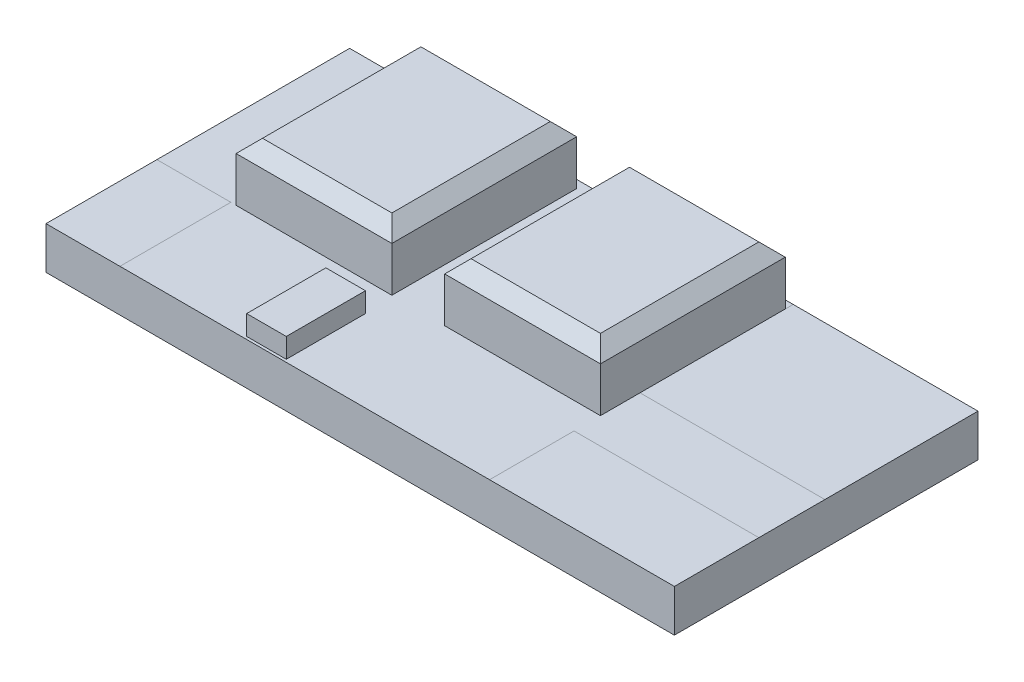
ISO-10303-21;
HEADER;
FILE_DESCRIPTION(('STEP AP214'),'2;1');
FILE_NAME('part.step','',(''),(''),'','','');
FILE_SCHEMA(('AUTOMOTIVE_DESIGN { 1 0 10303 214 1 1 1 1 }'));
ENDSEC;
DATA;
#1=APPLICATION_CONTEXT('core data for automotive mechanical design processes');
#2=APPLICATION_PROTOCOL_DEFINITION('international standard','automotive_design',2000,#1);
#3=PRODUCT_CONTEXT('',#1,'mechanical');
#4=PRODUCT('Part','Part','',(#3));
#5=PRODUCT_RELATED_PRODUCT_CATEGORY('part','',(#4));
#6=PRODUCT_DEFINITION_FORMATION('','',#4);
#7=PRODUCT_DEFINITION_CONTEXT('part definition',#1,'design');
#8=PRODUCT_DEFINITION('design','',#6,#7);
#9=PRODUCT_DEFINITION_SHAPE('','',#8);
#10=(LENGTH_UNIT() NAMED_UNIT(*) SI_UNIT(.MILLI.,.METRE.));
#11=(NAMED_UNIT(*) PLANE_ANGLE_UNIT() SI_UNIT($,.RADIAN.));
#12=(NAMED_UNIT(*) SI_UNIT($,.STERADIAN.) SOLID_ANGLE_UNIT());
#13=UNCERTAINTY_MEASURE_WITH_UNIT(LENGTH_MEASURE(1.E-05),#10,'distance_accuracy_value','');
#14=(GEOMETRIC_REPRESENTATION_CONTEXT(3) GLOBAL_UNCERTAINTY_ASSIGNED_CONTEXT((#13)) GLOBAL_UNIT_ASSIGNED_CONTEXT((#10,
#11,#12)) REPRESENTATION_CONTEXT('',''));
#15=CARTESIAN_POINT('',(0.,0.,0.));
#16=DIRECTION('',(0.,0.,1.));
#17=DIRECTION('',(1.,0.,0.));
#18=AXIS2_PLACEMENT_3D('',#15,#16,#17);
#19=CARTESIAN_POINT('',(-4.40000000000001,2.35,2.65));
#20=DIRECTION('',(1.,0.,0.));
#21=DIRECTION('',(0.,0.,-1.));
#22=AXIS2_PLACEMENT_3D('',#19,#20,#21);
#23=PLANE('',#22);
#24=DIRECTION('',(0.,0.,1.));
#25=VECTOR('',#24,1.);
#26=CARTESIAN_POINT('',(-4.40000000000001,1.6,2.65));
#27=LINE('',#26,#25);
#28=CARTESIAN_POINT('',(-4.40000000000001,1.6,2.65));
#29=VERTEX_POINT('',#28);
#30=CARTESIAN_POINT('',(-4.40000000000001,1.6,5.65));
#31=VERTEX_POINT('',#30);
#32=EDGE_CURVE('E125',#29,#31,#27,.T.);
#33=ORIENTED_EDGE('',*,*,#32,.T.);
#34=DIRECTION('',(0.,-1.,0.));
#35=VECTOR('',#34,1.);
#36=CARTESIAN_POINT('',(-4.40000000000001,2.35,5.65));
#37=LINE('',#36,#35);
#38=CARTESIAN_POINT('',(-4.40000000000001,2.35,5.65));
#39=VERTEX_POINT('',#38);
#40=EDGE_CURVE('E12',#39,#31,#37,.T.);
#41=ORIENTED_EDGE('',*,*,#40,.F.);
#42=DIRECTION('',(0.,0.,1.));
#43=VECTOR('',#42,1.);
#44=CARTESIAN_POINT('',(-4.40000000000001,2.35,2.65));
#45=LINE('',#44,#43);
#46=CARTESIAN_POINT('',(-4.40000000000001,2.35,2.65));
#47=VERTEX_POINT('',#46);
#48=EDGE_CURVE('E113',#47,#39,#45,.T.);
#49=ORIENTED_EDGE('',*,*,#48,.F.);
#50=DIRECTION('',(0.,-1.,0.));
#51=VECTOR('',#50,1.);
#52=CARTESIAN_POINT('',(-4.40000000000001,2.35,2.65));
#53=LINE('',#52,#51);
#54=EDGE_CURVE('E121',#47,#29,#53,.T.);
#55=ORIENTED_EDGE('',*,*,#54,.T.);
#56=EDGE_LOOP('',(#33,#41,#49,#55));
#57=FACE_BOUND('',#56,.T.);
#58=ADVANCED_FACE('F62',(#57),#23,.F.);
#59=CARTESIAN_POINT('',(-4.40000000000001,2.35,5.65));
#60=DIRECTION('',(0.,0.,-1.));
#61=DIRECTION('',(-1.,0.,0.));
#62=AXIS2_PLACEMENT_3D('',#59,#60,#61);
#63=PLANE('',#62);
#64=DIRECTION('',(1.,0.,0.));
#65=VECTOR('',#64,1.);
#66=CARTESIAN_POINT('',(-4.40000000000001,1.6,5.65));
#67=LINE('',#66,#65);
#68=CARTESIAN_POINT('',(-2.90000000000001,1.6,5.65));
#69=VERTEX_POINT('',#68);
#70=EDGE_CURVE('E117',#31,#69,#67,.T.);
#71=ORIENTED_EDGE('',*,*,#70,.T.);
#72=DIRECTION('',(0.,-1.,0.));
#73=VECTOR('',#72,1.);
#74=CARTESIAN_POINT('',(-2.90000000000001,2.35,5.65));
#75=LINE('',#74,#73);
#76=CARTESIAN_POINT('',(-2.90000000000001,2.35,5.65));
#77=VERTEX_POINT('',#76);
#78=EDGE_CURVE('E70',#77,#69,#75,.T.);
#79=ORIENTED_EDGE('',*,*,#78,.F.);
#80=DIRECTION('',(1.,0.,0.));
#81=VECTOR('',#80,1.);
#82=CARTESIAN_POINT('',(-4.40000000000001,2.35,5.65));
#83=LINE('',#82,#81);
#84=EDGE_CURVE('E108',#39,#77,#83,.T.);
#85=ORIENTED_EDGE('',*,*,#84,.F.);
#86=ORIENTED_EDGE('',*,*,#40,.T.);
#87=EDGE_LOOP('',(#71,#79,#85,#86));
#88=FACE_BOUND('',#87,.T.);
#89=ADVANCED_FACE('F116',(#88),#63,.F.);
#90=CARTESIAN_POINT('',(-2.90000000000001,2.35,2.65));
#91=DIRECTION('',(-1.,0.,0.));
#92=DIRECTION('',(0.,0.,1.));
#93=AXIS2_PLACEMENT_3D('',#90,#91,#92);
#94=PLANE('',#93);
#95=DIRECTION('',(0.,0.,-1.));
#96=VECTOR('',#95,1.);
#97=CARTESIAN_POINT('',(-2.90000000000001,1.6,2.65));
#98=LINE('',#97,#96);
#99=CARTESIAN_POINT('',(-2.90000000000001,1.6,2.65));
#100=VERTEX_POINT('',#99);
#101=EDGE_CURVE('E95',#69,#100,#98,.T.);
#102=ORIENTED_EDGE('',*,*,#101,.T.);
#103=DIRECTION('',(0.,-1.,0.));
#104=VECTOR('',#103,1.);
#105=CARTESIAN_POINT('',(-2.90000000000001,2.35,2.65));
#106=LINE('',#105,#104);
#107=CARTESIAN_POINT('',(-2.90000000000001,2.35,2.65));
#108=VERTEX_POINT('',#107);
#109=EDGE_CURVE('E118',#108,#100,#106,.T.);
#110=ORIENTED_EDGE('',*,*,#109,.F.);
#111=DIRECTION('',(0.,0.,-1.));
#112=VECTOR('',#111,1.);
#113=CARTESIAN_POINT('',(-2.90000000000001,2.35,2.65));
#114=LINE('',#113,#112);
#115=EDGE_CURVE('E111',#77,#108,#114,.T.);
#116=ORIENTED_EDGE('',*,*,#115,.F.);
#117=ORIENTED_EDGE('',*,*,#78,.T.);
#118=EDGE_LOOP('',(#102,#110,#116,#117));
#119=FACE_BOUND('',#118,.T.);
#120=ADVANCED_FACE('F119',(#119),#94,.F.);
#121=CARTESIAN_POINT('',(-4.40000000000001,2.35,2.65));
#122=DIRECTION('',(0.,0.,1.));
#123=DIRECTION('',(1.,0.,0.));
#124=AXIS2_PLACEMENT_3D('',#121,#122,#123);
#125=PLANE('',#124);
#126=DIRECTION('',(-1.,0.,0.));
#127=VECTOR('',#126,1.);
#128=CARTESIAN_POINT('',(-4.40000000000001,1.6,2.65));
#129=LINE('',#128,#127);
#130=EDGE_CURVE('E101',#100,#29,#129,.T.);
#131=ORIENTED_EDGE('',*,*,#130,.T.);
#132=ORIENTED_EDGE('',*,*,#54,.F.);
#133=DIRECTION('',(-1.,0.,0.));
#134=VECTOR('',#133,1.);
#135=CARTESIAN_POINT('',(-4.40000000000001,2.35,2.65));
#136=LINE('',#135,#134);
#137=EDGE_CURVE('E78',#108,#47,#136,.T.);
#138=ORIENTED_EDGE('',*,*,#137,.F.);
#139=ORIENTED_EDGE('',*,*,#109,.T.);
#140=EDGE_LOOP('',(#131,#132,#138,#139));
#141=FACE_BOUND('',#140,.T.);
#142=ADVANCED_FACE('F132',(#141),#125,.F.);
#143=CARTESIAN_POINT('',(0.,2.35,0.));
#144=DIRECTION('',(0.,1.,0.));
#145=DIRECTION('',(0.,0.,1.));
#146=AXIS2_PLACEMENT_3D('',#143,#144,#145);
#147=PLANE('',#146);
#148=ORIENTED_EDGE('',*,*,#48,.T.);
#149=ORIENTED_EDGE('',*,*,#84,.T.);
#150=ORIENTED_EDGE('',*,*,#115,.T.);
#151=ORIENTED_EDGE('',*,*,#137,.T.);
#152=EDGE_LOOP('',(#148,#149,#150,#151));
#153=FACE_BOUND('',#152,.T.);
#154=ADVANCED_FACE('F109',(#153),#147,.T.);
#155=CARTESIAN_POINT('',(0.,1.6,0.));
#156=DIRECTION('',(0.,1.,0.));
#157=DIRECTION('',(0.,0.,1.));
#158=AXIS2_PLACEMENT_3D('',#155,#156,#157);
#159=PLANE('',#158);
#160=ORIENTED_EDGE('',*,*,#32,.F.);
#161=ORIENTED_EDGE('',*,*,#130,.F.);
#162=ORIENTED_EDGE('',*,*,#101,.F.);
#163=ORIENTED_EDGE('',*,*,#70,.F.);
#164=EDGE_LOOP('',(#160,#161,#162,#163));
#165=FACE_BOUND('',#164,.T.);
#166=ADVANCED_FACE('F135',(#165),#159,.F.);
#167=CLOSED_SHELL('',(#58,#89,#120,#142,#154,#166));
#168=MANIFOLD_SOLID_BREP('B2',#167);
#169=CARTESIAN_POINT('',(-3.,3.8,-5.45));
#170=DIRECTION('',(-1.,0.,0.));
#171=DIRECTION('',(0.,0.,1.));
#172=AXIS2_PLACEMENT_3D('',#169,#170,#171);
#173=PLANE('',#172);
#174=DIRECTION('',(0.,-1.,0.));
#175=VECTOR('',#174,1.);
#176=CARTESIAN_POINT('',(-3.,3.8,-5.45));
#177=LINE('',#176,#175);
#178=CARTESIAN_POINT('',(-3.,3.3,-5.45));
#179=VERTEX_POINT('',#178);
#180=CARTESIAN_POINT('',(-3.,1.6,-5.45));
#181=VERTEX_POINT('',#180);
#182=EDGE_CURVE('E295',#179,#181,#177,.T.);
#183=ORIENTED_EDGE('',*,*,#182,.F.);
#184=DIRECTION('',(0.,0.,1.));
#185=VECTOR('',#184,1.);
#186=CARTESIAN_POINT('',(-3.,3.3,-5.45));
#187=LINE('',#186,#185);
#188=CARTESIAN_POINT('',(-3.,3.3,1.55));
#189=VERTEX_POINT('',#188);
#190=EDGE_CURVE('E221',#179,#189,#187,.T.);
#191=ORIENTED_EDGE('',*,*,#190,.T.);
#192=DIRECTION('',(0.,-1.,0.));
#193=VECTOR('',#192,1.);
#194=CARTESIAN_POINT('',(-3.,3.8,1.55));
#195=LINE('',#194,#193);
#196=CARTESIAN_POINT('',(-3.,1.6,1.55));
#197=VERTEX_POINT('',#196);
#198=EDGE_CURVE('E249',#189,#197,#195,.T.);
#199=ORIENTED_EDGE('',*,*,#198,.T.);
#200=DIRECTION('',(0.,0.,-1.));
#201=VECTOR('',#200,1.);
#202=CARTESIAN_POINT('',(-3.,1.6,-5.45));
#203=LINE('',#202,#201);
#204=EDGE_CURVE('E252',#197,#181,#203,.T.);
#205=ORIENTED_EDGE('',*,*,#204,.T.);
#206=EDGE_LOOP('',(#183,#191,#199,#205));
#207=FACE_BOUND('',#206,.T.);
#208=ADVANCED_FACE('F196',(#207),#173,.F.);
#209=CARTESIAN_POINT('',(-3.,3.8,-5.45));
#210=DIRECTION('',(0.,0.,1.));
#211=DIRECTION('',(1.,0.,0.));
#212=AXIS2_PLACEMENT_3D('',#209,#210,#211);
#213=PLANE('',#212);
#214=DIRECTION('',(0.,-1.,0.));
#215=VECTOR('',#214,1.);
#216=CARTESIAN_POINT('',(-8.90000000000001,3.8,-5.45));
#217=LINE('',#216,#215);
#218=CARTESIAN_POINT('',(-8.90000000000001,3.3,-5.45));
#219=VERTEX_POINT('',#218);
#220=CARTESIAN_POINT('',(-8.90000000000001,1.6,-5.45));
#221=VERTEX_POINT('',#220);
#222=EDGE_CURVE('E299',#219,#221,#217,.T.);
#223=ORIENTED_EDGE('',*,*,#222,.F.);
#224=DIRECTION('',(1.,0.,0.));
#225=VECTOR('',#224,1.);
#226=CARTESIAN_POINT('',(-3.,3.3,-5.45));
#227=LINE('',#226,#225);
#228=EDGE_CURVE('E280',#219,#179,#227,.T.);
#229=ORIENTED_EDGE('',*,*,#228,.T.);
#230=ORIENTED_EDGE('',*,*,#182,.T.);
#231=DIRECTION('',(-1.,0.,0.));
#232=VECTOR('',#231,1.);
#233=CARTESIAN_POINT('',(-3.,1.6,-5.45));
#234=LINE('',#233,#232);
#235=EDGE_CURVE('E266',#181,#221,#234,.T.);
#236=ORIENTED_EDGE('',*,*,#235,.T.);
#237=EDGE_LOOP('',(#223,#229,#230,#236));
#238=FACE_BOUND('',#237,.T.);
#239=ADVANCED_FACE('F308',(#238),#213,.F.);
#240=CARTESIAN_POINT('',(-8.90000000000001,3.8,-5.45));
#241=DIRECTION('',(1.,0.,0.));
#242=DIRECTION('',(0.,0.,-1.));
#243=AXIS2_PLACEMENT_3D('',#240,#241,#242);
#244=PLANE('',#243);
#245=DIRECTION('',(0.,-1.,0.));
#246=VECTOR('',#245,1.);
#247=CARTESIAN_POINT('',(-8.9,3.8,1.55));
#248=LINE('',#247,#246);
#249=CARTESIAN_POINT('',(-8.9,3.3,1.55));
#250=VERTEX_POINT('',#249);
#251=CARTESIAN_POINT('',(-8.9,1.6,1.55));
#252=VERTEX_POINT('',#251);
#253=EDGE_CURVE('E254',#250,#252,#248,.T.);
#254=ORIENTED_EDGE('',*,*,#253,.F.);
#255=DIRECTION('',(0.,0.,-1.));
#256=VECTOR('',#255,1.);
#257=CARTESIAN_POINT('',(-8.90000000000001,3.3,-5.45));
#258=LINE('',#257,#256);
#259=EDGE_CURVE('E60',#250,#219,#258,.T.);
#260=ORIENTED_EDGE('',*,*,#259,.T.);
#261=ORIENTED_EDGE('',*,*,#222,.T.);
#262=DIRECTION('',(0.,0.,1.));
#263=VECTOR('',#262,1.);
#264=CARTESIAN_POINT('',(-8.90000000000001,1.6,-5.45));
#265=LINE('',#264,#263);
#266=EDGE_CURVE('E261',#221,#252,#265,.T.);
#267=ORIENTED_EDGE('',*,*,#266,.T.);
#268=EDGE_LOOP('',(#254,#260,#261,#267));
#269=FACE_BOUND('',#268,.T.);
#270=ADVANCED_FACE('F305',(#269),#244,.F.);
#271=CARTESIAN_POINT('',(-3.,3.8,1.55));
#272=DIRECTION('',(0.,0.,-1.));
#273=DIRECTION('',(-1.,0.,0.));
#274=AXIS2_PLACEMENT_3D('',#271,#272,#273);
#275=PLANE('',#274);
#276=ORIENTED_EDGE('',*,*,#198,.F.);
#277=DIRECTION('',(-1.,0.,0.));
#278=VECTOR('',#277,1.);
#279=CARTESIAN_POINT('',(-3.,3.3,1.55));
#280=LINE('',#279,#278);
#281=EDGE_CURVE('E206',#189,#250,#280,.T.);
#282=ORIENTED_EDGE('',*,*,#281,.T.);
#283=ORIENTED_EDGE('',*,*,#253,.T.);
#284=DIRECTION('',(1.,0.,0.));
#285=VECTOR('',#284,1.);
#286=CARTESIAN_POINT('',(-3.,1.6,1.55));
#287=LINE('',#286,#285);
#288=EDGE_CURVE('E253',#252,#197,#287,.T.);
#289=ORIENTED_EDGE('',*,*,#288,.T.);
#290=EDGE_LOOP('',(#276,#282,#283,#289));
#291=FACE_BOUND('',#290,.T.);
#292=ADVANCED_FACE('F257',(#291),#275,.F.);
#293=CARTESIAN_POINT('',(0.,3.8,0.));
#294=DIRECTION('',(0.,-1.,0.));
#295=DIRECTION('',(0.,0.,-1.));
#296=AXIS2_PLACEMENT_3D('',#293,#294,#295);
#297=PLANE('',#296);
#298=DIRECTION('',(0.,0.,-1.));
#299=VECTOR('',#298,1.);
#300=CARTESIAN_POINT('',(-3.5,3.8,0.));
#301=LINE('',#300,#299);
#302=CARTESIAN_POINT('',(-3.5,3.8,1.05));
#303=VERTEX_POINT('',#302);
#304=CARTESIAN_POINT('',(-3.5,3.8,-4.95));
#305=VERTEX_POINT('',#304);
#306=EDGE_CURVE('E275',#303,#305,#301,.T.);
#307=ORIENTED_EDGE('',*,*,#306,.T.);
#308=DIRECTION('',(-1.,0.,0.));
#309=VECTOR('',#308,1.);
#310=CARTESIAN_POINT('',(0.,3.8,-4.95));
#311=LINE('',#310,#309);
#312=CARTESIAN_POINT('',(-8.4,3.8,-4.95));
#313=VERTEX_POINT('',#312);
#314=EDGE_CURVE('E277',#305,#313,#311,.T.);
#315=ORIENTED_EDGE('',*,*,#314,.T.);
#316=DIRECTION('',(0.,0.,1.));
#317=VECTOR('',#316,1.);
#318=CARTESIAN_POINT('',(-8.4,3.8,0.));
#319=LINE('',#318,#317);
#320=CARTESIAN_POINT('',(-8.4,3.8,1.05));
#321=VERTEX_POINT('',#320);
#322=EDGE_CURVE('E267',#313,#321,#319,.T.);
#323=ORIENTED_EDGE('',*,*,#322,.T.);
#324=DIRECTION('',(1.,0.,0.));
#325=VECTOR('',#324,1.);
#326=CARTESIAN_POINT('',(0.,3.8,1.05));
#327=LINE('',#326,#325);
#328=EDGE_CURVE('E269',#321,#303,#327,.T.);
#329=ORIENTED_EDGE('',*,*,#328,.T.);
#330=EDGE_LOOP('',(#307,#315,#323,#329));
#331=FACE_BOUND('',#330,.T.);
#332=ADVANCED_FACE('F320',(#331),#297,.F.);
#333=CARTESIAN_POINT('',(0.,1.6,0.));
#334=DIRECTION('',(0.,-1.,0.));
#335=DIRECTION('',(0.,0.,-1.));
#336=AXIS2_PLACEMENT_3D('',#333,#334,#335);
#337=PLANE('',#336);
#338=ORIENTED_EDGE('',*,*,#204,.F.);
#339=ORIENTED_EDGE('',*,*,#288,.F.);
#340=ORIENTED_EDGE('',*,*,#266,.F.);
#341=ORIENTED_EDGE('',*,*,#235,.F.);
#342=EDGE_LOOP('',(#338,#339,#340,#341));
#343=FACE_BOUND('',#342,.T.);
#344=ADVANCED_FACE('F264',(#343),#337,.T.);
#345=CARTESIAN_POINT('',(0.,3.8,1.05));
#346=DIRECTION('',(0.,-0.707106781186546,-0.707106781186549));
#347=DIRECTION('',(1.,0.,0.));
#348=AXIS2_PLACEMENT_3D('',#345,#346,#347);
#349=PLANE('',#348);
#350=DIRECTION('',(0.577350269189627,0.577350269189626,-0.577350269189624));
#351=VECTOR('',#350,1.);
#352=CARTESIAN_POINT('',(-8.05,4.15,0.700000000000004));
#353=LINE('',#352,#351);
#354=EDGE_CURVE('E288',#250,#321,#353,.T.);
#355=ORIENTED_EDGE('',*,*,#354,.F.);
#356=ORIENTED_EDGE('',*,*,#281,.F.);
#357=DIRECTION('',(-0.577350269189625,0.577350269189627,-0.577350269189625));
#358=VECTOR('',#357,1.);
#359=CARTESIAN_POINT('',(-2.33333333333334,2.63333333333333,2.21666666666667));
#360=LINE('',#359,#358);
#361=EDGE_CURVE('E201',#303,#189,#360,.F.);
#362=ORIENTED_EDGE('',*,*,#361,.F.);
#363=ORIENTED_EDGE('',*,*,#328,.F.);
#364=EDGE_LOOP('',(#355,#356,#362,#363));
#365=FACE_BOUND('',#364,.T.);
#366=ADVANCED_FACE('F199',(#365),#349,.F.);
#367=CARTESIAN_POINT('',(-3.5,3.8,0.));
#368=DIRECTION('',(-0.707106781186549,-0.707106781186546,0.));
#369=DIRECTION('',(0.,0.,-1.));
#370=AXIS2_PLACEMENT_3D('',#367,#368,#369);
#371=PLANE('',#370);
#372=ORIENTED_EDGE('',*,*,#361,.T.);
#373=ORIENTED_EDGE('',*,*,#190,.F.);
#374=DIRECTION('',(-0.577350269189625,0.577350269189627,0.577350269189625));
#375=VECTOR('',#374,1.);
#376=CARTESIAN_POINT('',(-5.15,5.45,-3.3));
#377=LINE('',#376,#375);
#378=EDGE_CURVE('E287',#305,#179,#377,.F.);
#379=ORIENTED_EDGE('',*,*,#378,.F.);
#380=ORIENTED_EDGE('',*,*,#306,.F.);
#381=EDGE_LOOP('',(#372,#373,#379,#380));
#382=FACE_BOUND('',#381,.T.);
#383=ADVANCED_FACE('F339',(#382),#371,.F.);
#384=CARTESIAN_POINT('',(-8.4,3.8,0.));
#385=DIRECTION('',(0.707106781186547,-0.707106781186548,0.));
#386=DIRECTION('',(0.,0.,1.));
#387=AXIS2_PLACEMENT_3D('',#384,#385,#386);
#388=PLANE('',#387);
#389=ORIENTED_EDGE('',*,*,#354,.T.);
#390=ORIENTED_EDGE('',*,*,#322,.F.);
#391=DIRECTION('',(-0.577350269189627,-0.577350269189626,-0.577350269189624));
#392=VECTOR('',#391,1.);
#393=CARTESIAN_POINT('',(-6.75,5.45,-3.30000000000001));
#394=LINE('',#393,#392);
#395=EDGE_CURVE('E285',#219,#313,#394,.F.);
#396=ORIENTED_EDGE('',*,*,#395,.F.);
#397=ORIENTED_EDGE('',*,*,#259,.F.);
#398=EDGE_LOOP('',(#389,#390,#396,#397));
#399=FACE_BOUND('',#398,.T.);
#400=ADVANCED_FACE('F333',(#399),#388,.F.);
#401=CARTESIAN_POINT('',(0.,3.8,-4.95));
#402=DIRECTION('',(0.,-0.707106781186546,0.707106781186549));
#403=DIRECTION('',(-1.,0.,0.));
#404=AXIS2_PLACEMENT_3D('',#401,#402,#403);
#405=PLANE('',#404);
#406=ORIENTED_EDGE('',*,*,#378,.T.);
#407=ORIENTED_EDGE('',*,*,#228,.F.);
#408=ORIENTED_EDGE('',*,*,#395,.T.);
#409=ORIENTED_EDGE('',*,*,#314,.F.);
#410=EDGE_LOOP('',(#406,#407,#408,#409));
#411=FACE_BOUND('',#410,.T.);
#412=ADVANCED_FACE('F327',(#411),#405,.F.);
#413=CLOSED_SHELL('',(#208,#239,#270,#292,#332,#344,#366,#383,#400,#412));
#414=MANIFOLD_SOLID_BREP('B6',#413);
#415=CARTESIAN_POINT('',(-1.,3.8,-5.45));
#416=DIRECTION('',(1.,0.,0.));
#417=DIRECTION('',(0.,0.,-1.));
#418=AXIS2_PLACEMENT_3D('',#415,#416,#417);
#419=PLANE('',#418);
#420=DIRECTION('',(0.,-1.,0.));
#421=VECTOR('',#420,1.);
#422=CARTESIAN_POINT('',(-1.,3.8,1.55));
#423=LINE('',#422,#421);
#424=CARTESIAN_POINT('',(-1.,3.3,1.55));
#425=VERTEX_POINT('',#424);
#426=CARTESIAN_POINT('',(-1.,1.6,1.55));
#427=VERTEX_POINT('',#426);
#428=EDGE_CURVE('E474',#425,#427,#423,.T.);
#429=ORIENTED_EDGE('',*,*,#428,.F.);
#430=DIRECTION('',(0.,0.,-1.));
#431=VECTOR('',#430,1.);
#432=CARTESIAN_POINT('',(-1.,3.3,-5.45));
#433=LINE('',#432,#431);
#434=CARTESIAN_POINT('',(-1.,3.3,-5.45));
#435=VERTEX_POINT('',#434);
#436=EDGE_CURVE('E431',#425,#435,#433,.T.);
#437=ORIENTED_EDGE('',*,*,#436,.T.);
#438=DIRECTION('',(0.,-1.,0.));
#439=VECTOR('',#438,1.);
#440=CARTESIAN_POINT('',(-1.,3.8,-5.45));
#441=LINE('',#440,#439);
#442=CARTESIAN_POINT('',(-1.,1.6,-5.45));
#443=VERTEX_POINT('',#442);
#444=EDGE_CURVE('E491',#435,#443,#441,.T.);
#445=ORIENTED_EDGE('',*,*,#444,.T.);
#446=DIRECTION('',(0.,0.,1.));
#447=VECTOR('',#446,1.);
#448=CARTESIAN_POINT('',(-1.,1.6,-5.45));
#449=LINE('',#448,#447);
#450=EDGE_CURVE('E487',#443,#427,#449,.T.);
#451=ORIENTED_EDGE('',*,*,#450,.T.);
#452=EDGE_LOOP('',(#429,#437,#445,#451));
#453=FACE_BOUND('',#452,.T.);
#454=ADVANCED_FACE('F421',(#453),#419,.F.);
#455=CARTESIAN_POINT('',(-1.,3.8,1.55));
#456=DIRECTION('',(0.,0.,-1.));
#457=DIRECTION('',(-1.,0.,0.));
#458=AXIS2_PLACEMENT_3D('',#455,#456,#457);
#459=PLANE('',#458);
#460=DIRECTION('',(0.,-1.,0.));
#461=VECTOR('',#460,1.);
#462=CARTESIAN_POINT('',(4.9,3.8,1.54999999999999));
#463=LINE('',#462,#461);
#464=CARTESIAN_POINT('',(4.9,3.3,1.54999999999999));
#465=VERTEX_POINT('',#464);
#466=CARTESIAN_POINT('',(4.9,1.6,1.54999999999999));
#467=VERTEX_POINT('',#466);
#468=EDGE_CURVE('E481',#465,#467,#463,.T.);
#469=ORIENTED_EDGE('',*,*,#468,.F.);
#470=DIRECTION('',(-1.,0.,0.));
#471=VECTOR('',#470,1.);
#472=CARTESIAN_POINT('',(-1.,3.3,1.55));
#473=LINE('',#472,#471);
#474=EDGE_CURVE('E446',#465,#425,#473,.T.);
#475=ORIENTED_EDGE('',*,*,#474,.T.);
#476=ORIENTED_EDGE('',*,*,#428,.T.);
#477=DIRECTION('',(1.,0.,0.));
#478=VECTOR('',#477,1.);
#479=CARTESIAN_POINT('',(-1.,1.6,1.55));
#480=LINE('',#479,#478);
#481=EDGE_CURVE('E477',#427,#467,#480,.T.);
#482=ORIENTED_EDGE('',*,*,#481,.T.);
#483=EDGE_LOOP('',(#469,#475,#476,#482));
#484=FACE_BOUND('',#483,.T.);
#485=ADVANCED_FACE('F476',(#484),#459,.F.);
#486=CARTESIAN_POINT('',(4.9,3.8,-5.45));
#487=DIRECTION('',(-1.,0.,0.));
#488=DIRECTION('',(0.,0.,1.));
#489=AXIS2_PLACEMENT_3D('',#486,#487,#488);
#490=PLANE('',#489);
#491=DIRECTION('',(0.,-1.,0.));
#492=VECTOR('',#491,1.);
#493=CARTESIAN_POINT('',(4.9,3.8,-5.45));
#494=LINE('',#493,#492);
#495=CARTESIAN_POINT('',(4.9,3.3,-5.45));
#496=VERTEX_POINT('',#495);
#497=CARTESIAN_POINT('',(4.9,1.6,-5.45));
#498=VERTEX_POINT('',#497);
#499=EDGE_CURVE('E501',#496,#498,#494,.T.);
#500=ORIENTED_EDGE('',*,*,#499,.F.);
#501=DIRECTION('',(0.,0.,1.));
#502=VECTOR('',#501,1.);
#503=CARTESIAN_POINT('',(4.9,3.3,1.54999999999999));
#504=LINE('',#503,#502);
#505=EDGE_CURVE('E512',#496,#465,#504,.T.);
#506=ORIENTED_EDGE('',*,*,#505,.T.);
#507=ORIENTED_EDGE('',*,*,#468,.T.);
#508=DIRECTION('',(0.,0.,-1.));
#509=VECTOR('',#508,1.);
#510=CARTESIAN_POINT('',(4.9,1.6,-5.45));
#511=LINE('',#510,#509);
#512=EDGE_CURVE('E489',#467,#498,#511,.T.);
#513=ORIENTED_EDGE('',*,*,#512,.T.);
#514=EDGE_LOOP('',(#500,#506,#507,#513));
#515=FACE_BOUND('',#514,.T.);
#516=ADVANCED_FACE('F540',(#515),#490,.F.);
#517=CARTESIAN_POINT('',(-1.,3.8,-5.45));
#518=DIRECTION('',(0.,0.,1.));
#519=DIRECTION('',(1.,0.,0.));
#520=AXIS2_PLACEMENT_3D('',#517,#518,#519);
#521=PLANE('',#520);
#522=ORIENTED_EDGE('',*,*,#444,.F.);
#523=DIRECTION('',(1.,0.,0.));
#524=VECTOR('',#523,1.);
#525=CARTESIAN_POINT('',(4.9,3.3,-5.45));
#526=LINE('',#525,#524);
#527=EDGE_CURVE('E194',#435,#496,#526,.T.);
#528=ORIENTED_EDGE('',*,*,#527,.T.);
#529=ORIENTED_EDGE('',*,*,#499,.T.);
#530=DIRECTION('',(-1.,0.,0.));
#531=VECTOR('',#530,1.);
#532=CARTESIAN_POINT('',(-1.,1.6,-5.45));
#533=LINE('',#532,#531);
#534=EDGE_CURVE('E498',#498,#443,#533,.T.);
#535=ORIENTED_EDGE('',*,*,#534,.T.);
#536=EDGE_LOOP('',(#522,#528,#529,#535));
#537=FACE_BOUND('',#536,.T.);
#538=ADVANCED_FACE('F542',(#537),#521,.F.);
#539=CARTESIAN_POINT('',(0.,3.8,0.));
#540=DIRECTION('',(0.,1.,0.));
#541=DIRECTION('',(0.,0.,1.));
#542=AXIS2_PLACEMENT_3D('',#539,#540,#541);
#543=PLANE('',#542);
#544=DIRECTION('',(1.,0.,0.));
#545=VECTOR('',#544,1.);
#546=CARTESIAN_POINT('',(4.9,3.8,1.04999999999999));
#547=LINE('',#546,#545);
#548=CARTESIAN_POINT('',(-0.500000000000002,3.8,1.05));
#549=VERTEX_POINT('',#548);
#550=CARTESIAN_POINT('',(4.4,3.8,1.04999999999999));
#551=VERTEX_POINT('',#550);
#552=EDGE_CURVE('E507',#549,#551,#547,.T.);
#553=ORIENTED_EDGE('',*,*,#552,.T.);
#554=DIRECTION('',(0.,0.,-1.));
#555=VECTOR('',#554,1.);
#556=CARTESIAN_POINT('',(4.39999999999999,3.8,-5.45));
#557=LINE('',#556,#555);
#558=CARTESIAN_POINT('',(4.39999999999999,3.8,-4.95));
#559=VERTEX_POINT('',#558);
#560=EDGE_CURVE('E509',#551,#559,#557,.T.);
#561=ORIENTED_EDGE('',*,*,#560,.T.);
#562=DIRECTION('',(-1.,0.,0.));
#563=VECTOR('',#562,1.);
#564=CARTESIAN_POINT('',(-1.,3.8,-4.95));
#565=LINE('',#564,#563);
#566=CARTESIAN_POINT('',(-0.500000000000003,3.8,-4.95));
#567=VERTEX_POINT('',#566);
#568=EDGE_CURVE('E480',#559,#567,#565,.T.);
#569=ORIENTED_EDGE('',*,*,#568,.T.);
#570=DIRECTION('',(0.,0.,1.));
#571=VECTOR('',#570,1.);
#572=CARTESIAN_POINT('',(-0.500000000000002,3.8,1.55));
#573=LINE('',#572,#571);
#574=EDGE_CURVE('E505',#567,#549,#573,.T.);
#575=ORIENTED_EDGE('',*,*,#574,.T.);
#576=EDGE_LOOP('',(#553,#561,#569,#575));
#577=FACE_BOUND('',#576,.T.);
#578=ADVANCED_FACE('F532',(#577),#543,.T.);
#579=CARTESIAN_POINT('',(0.,1.6,0.));
#580=DIRECTION('',(0.,1.,0.));
#581=DIRECTION('',(0.,0.,1.));
#582=AXIS2_PLACEMENT_3D('',#579,#580,#581);
#583=PLANE('',#582);
#584=ORIENTED_EDGE('',*,*,#450,.F.);
#585=ORIENTED_EDGE('',*,*,#534,.F.);
#586=ORIENTED_EDGE('',*,*,#512,.F.);
#587=ORIENTED_EDGE('',*,*,#481,.F.);
#588=EDGE_LOOP('',(#584,#585,#586,#587));
#589=FACE_BOUND('',#588,.T.);
#590=ADVANCED_FACE('F485',(#589),#583,.F.);
#591=CARTESIAN_POINT('',(-0.500000000000002,3.8,0.));
#592=DIRECTION('',(-0.707106781186549,0.707106781186546,0.));
#593=DIRECTION('',(0.,0.,-1.));
#594=AXIS2_PLACEMENT_3D('',#591,#592,#593);
#595=PLANE('',#594);
#596=DIRECTION('',(0.577350269189625,0.577350269189627,0.577350269189625));
#597=VECTOR('',#596,1.);
#598=CARTESIAN_POINT('',(-0.333333333333336,3.96666666666667,-4.78333333333333));
#599=LINE('',#598,#597);
#600=EDGE_CURVE('E495',#435,#567,#599,.T.);
#601=ORIENTED_EDGE('',*,*,#600,.F.);
#602=ORIENTED_EDGE('',*,*,#436,.F.);
#603=DIRECTION('',(0.577350269189625,0.577350269189627,-0.577350269189626));
#604=VECTOR('',#603,1.);
#605=CARTESIAN_POINT('',(-0.150000000000003,4.15,0.7));
#606=LINE('',#605,#604);
#607=EDGE_CURVE('E426',#549,#425,#606,.F.);
#608=ORIENTED_EDGE('',*,*,#607,.F.);
#609=ORIENTED_EDGE('',*,*,#574,.F.);
#610=EDGE_LOOP('',(#601,#602,#608,#609));
#611=FACE_BOUND('',#610,.T.);
#612=ADVANCED_FACE('F424',(#611),#595,.T.);
#613=CARTESIAN_POINT('',(0.,3.8,1.05));
#614=DIRECTION('',(0.,0.707106781186546,0.707106781186549));
#615=DIRECTION('',(-1.,0.,0.));
#616=AXIS2_PLACEMENT_3D('',#613,#614,#615);
#617=PLANE('',#616);
#618=ORIENTED_EDGE('',*,*,#607,.T.);
#619=ORIENTED_EDGE('',*,*,#474,.F.);
#620=DIRECTION('',(-0.577350269189625,0.577350269189627,-0.577350269189625));
#621=VECTOR('',#620,1.);
#622=CARTESIAN_POINT('',(2.93333333333333,5.26666666666667,-0.416666666666666));
#623=LINE('',#622,#621);
#624=EDGE_CURVE('E519',#551,#465,#623,.F.);
#625=ORIENTED_EDGE('',*,*,#624,.F.);
#626=ORIENTED_EDGE('',*,*,#552,.F.);
#627=EDGE_LOOP('',(#618,#619,#625,#626));
#628=FACE_BOUND('',#627,.T.);
#629=ADVANCED_FACE('F570',(#628),#617,.T.);
#630=CARTESIAN_POINT('',(0.,3.8,-4.95));
#631=DIRECTION('',(0.,0.707106781186546,-0.707106781186549));
#632=DIRECTION('',(1.,0.,0.));
#633=AXIS2_PLACEMENT_3D('',#630,#631,#632);
#634=PLANE('',#633);
#635=ORIENTED_EDGE('',*,*,#600,.T.);
#636=ORIENTED_EDGE('',*,*,#568,.F.);
#637=DIRECTION('',(0.577350269189625,-0.577350269189627,-0.577350269189625));
#638=VECTOR('',#637,1.);
#639=CARTESIAN_POINT('',(2.93333333333333,5.26666666666667,-3.48333333333334));
#640=LINE('',#639,#638);
#641=EDGE_CURVE('E517',#496,#559,#640,.F.);
#642=ORIENTED_EDGE('',*,*,#641,.F.);
#643=ORIENTED_EDGE('',*,*,#527,.F.);
#644=EDGE_LOOP('',(#635,#636,#642,#643));
#645=FACE_BOUND('',#644,.T.);
#646=ADVANCED_FACE('F525',(#645),#634,.T.);
#647=CARTESIAN_POINT('',(4.4,3.8,0.));
#648=DIRECTION('',(0.707106781186549,0.707106781186546,0.));
#649=DIRECTION('',(0.,0.,1.));
#650=AXIS2_PLACEMENT_3D('',#647,#648,#649);
#651=PLANE('',#650);
#652=ORIENTED_EDGE('',*,*,#624,.T.);
#653=ORIENTED_EDGE('',*,*,#505,.F.);
#654=ORIENTED_EDGE('',*,*,#641,.T.);
#655=ORIENTED_EDGE('',*,*,#560,.F.);
#656=EDGE_LOOP('',(#652,#653,#654,#655));
#657=FACE_BOUND('',#656,.T.);
#658=ADVANCED_FACE('F536',(#657),#651,.T.);
#659=CLOSED_SHELL('',(#454,#485,#516,#538,#578,#590,#612,#629,#646,#658));
#660=MANIFOLD_SOLID_BREP('B54',#659);
#661=CARTESIAN_POINT('',(0.,1.6,0.));
#662=DIRECTION('',(0.,1.,0.));
#663=DIRECTION('',(0.,0.,1.));
#664=AXIS2_PLACEMENT_3D('',#661,#662,#663);
#665=PLANE('',#664);
#666=DIRECTION('',(1.,0.,0.));
#667=VECTOR('',#666,1.);
#668=CARTESIAN_POINT('',(-11.9,1.6,5.75));
#669=LINE('',#668,#667);
#670=CARTESIAN_POINT('',(-9.1,1.6,5.75));
#671=VERTEX_POINT('',#670);
#672=CARTESIAN_POINT('',(4.9,1.6,5.75));
#673=VERTEX_POINT('',#672);
#674=EDGE_CURVE('E759',#671,#673,#669,.T.);
#675=ORIENTED_EDGE('',*,*,#674,.T.);
#676=DIRECTION('',(0.,0.,-1.));
#677=VECTOR('',#676,1.);
#678=CARTESIAN_POINT('',(4.9,1.6,0.));
#679=LINE('',#678,#677);
#680=CARTESIAN_POINT('',(4.9,1.6,2.54999999999999));
#681=VERTEX_POINT('',#680);
#682=EDGE_CURVE('E419',#673,#681,#679,.T.);
#683=ORIENTED_EDGE('',*,*,#682,.T.);
#684=DIRECTION('',(1.,0.,0.));
#685=VECTOR('',#684,1.);
#686=CARTESIAN_POINT('',(0.,1.6,2.54999999999999));
#687=LINE('',#686,#685);
#688=CARTESIAN_POINT('',(11.9,1.6,2.54999999999999));
#689=VERTEX_POINT('',#688);
#690=EDGE_CURVE('E646',#681,#689,#687,.T.);
#691=ORIENTED_EDGE('',*,*,#690,.T.);
#692=DIRECTION('',(0.,0.,-1.));
#693=VECTOR('',#692,1.);
#694=CARTESIAN_POINT('',(11.9,1.6,-5.75));
#695=LINE('',#694,#693);
#696=CARTESIAN_POINT('',(11.9,1.6,0.0499999999999954));
#697=VERTEX_POINT('',#696);
#698=EDGE_CURVE('E710',#689,#697,#695,.T.);
#699=ORIENTED_EDGE('',*,*,#698,.T.);
#700=DIRECTION('',(-1.,0.,0.));
#701=VECTOR('',#700,1.);
#702=CARTESIAN_POINT('',(0.,1.6,0.0499999999999959));
#703=LINE('',#702,#701);
#704=CARTESIAN_POINT('',(4.9,1.6,0.0499999999999954));
#705=VERTEX_POINT('',#704);
#706=EDGE_CURVE('E707',#697,#705,#703,.T.);
#707=ORIENTED_EDGE('',*,*,#706,.T.);
#708=DIRECTION('',(0.,0.,-1.));
#709=VECTOR('',#708,1.);
#710=CARTESIAN_POINT('',(4.9,1.6,0.));
#711=LINE('',#710,#709);
#712=CARTESIAN_POINT('',(4.9,1.6,-5.75));
#713=VERTEX_POINT('',#712);
#714=EDGE_CURVE('E730',#705,#713,#711,.T.);
#715=ORIENTED_EDGE('',*,*,#714,.T.);
#716=DIRECTION('',(-1.,0.,0.));
#717=VECTOR('',#716,1.);
#718=CARTESIAN_POINT('',(-11.9,1.6,-5.75));
#719=LINE('',#718,#717);
#720=CARTESIAN_POINT('',(-11.9,1.6,-5.75));
#721=VERTEX_POINT('',#720);
#722=EDGE_CURVE('E721',#713,#721,#719,.T.);
#723=ORIENTED_EDGE('',*,*,#722,.T.);
#724=DIRECTION('',(0.,0.,1.));
#725=VECTOR('',#724,1.);
#726=CARTESIAN_POINT('',(-11.9,1.6,-5.75));
#727=LINE('',#726,#725);
#728=CARTESIAN_POINT('',(-11.9,1.6,1.55));
#729=VERTEX_POINT('',#728);
#730=EDGE_CURVE('E779',#721,#729,#727,.T.);
#731=ORIENTED_EDGE('',*,*,#730,.T.);
#732=DIRECTION('',(1.,0.,0.));
#733=VECTOR('',#732,1.);
#734=CARTESIAN_POINT('',(0.,1.6,1.55));
#735=LINE('',#734,#733);
#736=CARTESIAN_POINT('',(-9.1,1.6,1.55));
#737=VERTEX_POINT('',#736);
#738=EDGE_CURVE('E739',#729,#737,#735,.T.);
#739=ORIENTED_EDGE('',*,*,#738,.T.);
#740=DIRECTION('',(0.,0.,1.));
#741=VECTOR('',#740,1.);
#742=CARTESIAN_POINT('',(-9.1,1.6,0.));
#743=LINE('',#742,#741);
#744=EDGE_CURVE('E743',#737,#671,#743,.T.);
#745=ORIENTED_EDGE('',*,*,#744,.T.);
#746=EDGE_LOOP('',(#675,#683,#691,#699,#707,#715,#723,#731,#739,#745));
#747=FACE_BOUND('',#746,.T.);
#748=ADVANCED_FACE('F637',(#747),#665,.T.);
#749=ORIENTED_EDGE('',*,*,#682,.F.);
#750=CARTESIAN_POINT('',(11.9,1.6,5.75));
#751=VERTEX_POINT('',#750);
#752=EDGE_CURVE('E770',#673,#751,#669,.T.);
#753=ORIENTED_EDGE('',*,*,#752,.T.);
#754=EDGE_CURVE('E713',#751,#689,#695,.T.);
#755=ORIENTED_EDGE('',*,*,#754,.T.);
#756=ORIENTED_EDGE('',*,*,#690,.F.);
#757=EDGE_LOOP('',(#749,#753,#755,#756));
#758=FACE_BOUND('',#757,.T.);
#759=ADVANCED_FACE('F803',(#758),#665,.T.);
#760=ORIENTED_EDGE('',*,*,#744,.F.);
#761=ORIENTED_EDGE('',*,*,#738,.F.);
#762=CARTESIAN_POINT('',(-11.9,1.6,5.75));
#763=VERTEX_POINT('',#762);
#764=EDGE_CURVE('E722',#729,#763,#727,.T.);
#765=ORIENTED_EDGE('',*,*,#764,.T.);
#766=EDGE_CURVE('E768',#763,#671,#669,.T.);
#767=ORIENTED_EDGE('',*,*,#766,.T.);
#768=EDGE_LOOP('',(#760,#761,#765,#767));
#769=FACE_BOUND('',#768,.T.);
#770=ADVANCED_FACE('F772',(#769),#665,.T.);
#771=CARTESIAN_POINT('',(11.9,1.6,-5.75));
#772=DIRECTION('',(-1.,0.,0.));
#773=DIRECTION('',(0.,0.,1.));
#774=AXIS2_PLACEMENT_3D('',#771,#772,#773);
#775=PLANE('',#774);
#776=DIRECTION('',(0.,0.,-1.));
#777=VECTOR('',#776,1.);
#778=CARTESIAN_POINT('',(11.9,0.,-5.75));
#779=LINE('',#778,#777);
#780=CARTESIAN_POINT('',(11.9,0.,5.75));
#781=VERTEX_POINT('',#780);
#782=CARTESIAN_POINT('',(11.9,0.,-5.75));
#783=VERTEX_POINT('',#782);
#784=EDGE_CURVE('E726',#781,#783,#779,.T.);
#785=ORIENTED_EDGE('',*,*,#784,.T.);
#786=DIRECTION('',(0.,-1.,0.));
#787=VECTOR('',#786,1.);
#788=CARTESIAN_POINT('',(11.9,1.6,-5.75));
#789=LINE('',#788,#787);
#790=CARTESIAN_POINT('',(11.9,1.6,-5.75));
#791=VERTEX_POINT('',#790);
#792=EDGE_CURVE('E718',#791,#783,#789,.T.);
#793=ORIENTED_EDGE('',*,*,#792,.F.);
#794=EDGE_CURVE('E702',#697,#791,#695,.T.);
#795=ORIENTED_EDGE('',*,*,#794,.F.);
#796=ORIENTED_EDGE('',*,*,#698,.F.);
#797=ORIENTED_EDGE('',*,*,#754,.F.);
#798=DIRECTION('',(0.,-1.,0.));
#799=VECTOR('',#798,1.);
#800=CARTESIAN_POINT('',(11.9,1.6,5.75));
#801=LINE('',#800,#799);
#802=EDGE_CURVE('E775',#751,#781,#801,.T.);
#803=ORIENTED_EDGE('',*,*,#802,.T.);
#804=EDGE_LOOP('',(#785,#793,#795,#796,#797,#803));
#805=FACE_BOUND('',#804,.T.);
#806=ADVANCED_FACE('F639',(#805),#775,.F.);
#807=CARTESIAN_POINT('',(-11.9,1.6,-5.75));
#808=DIRECTION('',(0.,0.,1.));
#809=DIRECTION('',(1.,0.,0.));
#810=AXIS2_PLACEMENT_3D('',#807,#808,#809);
#811=PLANE('',#810);
#812=DIRECTION('',(-1.,0.,0.));
#813=VECTOR('',#812,1.);
#814=CARTESIAN_POINT('',(-11.9,0.,-5.75));
#815=LINE('',#814,#813);
#816=CARTESIAN_POINT('',(-11.9,0.,-5.75));
#817=VERTEX_POINT('',#816);
#818=EDGE_CURVE('E788',#783,#817,#815,.T.);
#819=ORIENTED_EDGE('',*,*,#818,.T.);
#820=DIRECTION('',(0.,-1.,0.));
#821=VECTOR('',#820,1.);
#822=CARTESIAN_POINT('',(-11.9,1.6,-5.75));
#823=LINE('',#822,#821);
#824=EDGE_CURVE('E727',#721,#817,#823,.T.);
#825=ORIENTED_EDGE('',*,*,#824,.F.);
#826=ORIENTED_EDGE('',*,*,#722,.F.);
#827=EDGE_CURVE('E705',#791,#713,#719,.T.);
#828=ORIENTED_EDGE('',*,*,#827,.F.);
#829=ORIENTED_EDGE('',*,*,#792,.T.);
#830=EDGE_LOOP('',(#819,#825,#826,#828,#829));
#831=FACE_BOUND('',#830,.T.);
#832=ADVANCED_FACE('F717',(#831),#811,.F.);
#833=CARTESIAN_POINT('',(-11.9,1.6,-5.75));
#834=DIRECTION('',(1.,0.,0.));
#835=DIRECTION('',(0.,0.,-1.));
#836=AXIS2_PLACEMENT_3D('',#833,#834,#835);
#837=PLANE('',#836);
#838=DIRECTION('',(0.,0.,1.));
#839=VECTOR('',#838,1.);
#840=CARTESIAN_POINT('',(-11.9,0.,-5.75));
#841=LINE('',#840,#839);
#842=CARTESIAN_POINT('',(-11.9,0.,5.75));
#843=VERTEX_POINT('',#842);
#844=EDGE_CURVE('E789',#817,#843,#841,.T.);
#845=ORIENTED_EDGE('',*,*,#844,.T.);
#846=DIRECTION('',(0.,-1.,0.));
#847=VECTOR('',#846,1.);
#848=CARTESIAN_POINT('',(-11.9,1.6,5.75));
#849=LINE('',#848,#847);
#850=EDGE_CURVE('E733',#763,#843,#849,.T.);
#851=ORIENTED_EDGE('',*,*,#850,.F.);
#852=ORIENTED_EDGE('',*,*,#764,.F.);
#853=ORIENTED_EDGE('',*,*,#730,.F.);
#854=ORIENTED_EDGE('',*,*,#824,.T.);
#855=EDGE_LOOP('',(#845,#851,#852,#853,#854));
#856=FACE_BOUND('',#855,.T.);
#857=ADVANCED_FACE('F794',(#856),#837,.F.);
#858=CARTESIAN_POINT('',(-11.9,1.6,5.75));
#859=DIRECTION('',(0.,0.,-1.));
#860=DIRECTION('',(-1.,0.,0.));
#861=AXIS2_PLACEMENT_3D('',#858,#859,#860);
#862=PLANE('',#861);
#863=DIRECTION('',(1.,0.,0.));
#864=VECTOR('',#863,1.);
#865=CARTESIAN_POINT('',(-11.9,0.,5.75));
#866=LINE('',#865,#864);
#867=EDGE_CURVE('E711',#843,#781,#866,.T.);
#868=ORIENTED_EDGE('',*,*,#867,.T.);
#869=ORIENTED_EDGE('',*,*,#802,.F.);
#870=ORIENTED_EDGE('',*,*,#752,.F.);
#871=ORIENTED_EDGE('',*,*,#674,.F.);
#872=ORIENTED_EDGE('',*,*,#766,.F.);
#873=ORIENTED_EDGE('',*,*,#850,.T.);
#874=EDGE_LOOP('',(#868,#869,#870,#871,#872,#873));
#875=FACE_BOUND('',#874,.T.);
#876=ADVANCED_FACE('F766',(#875),#862,.F.);
#877=ORIENTED_EDGE('',*,*,#714,.F.);
#878=ORIENTED_EDGE('',*,*,#706,.F.);
#879=ORIENTED_EDGE('',*,*,#794,.T.);
#880=ORIENTED_EDGE('',*,*,#827,.T.);
#881=EDGE_LOOP('',(#877,#878,#879,#880));
#882=FACE_BOUND('',#881,.T.);
#883=ADVANCED_FACE('F704',(#882),#665,.T.);
#884=CARTESIAN_POINT('',(0.,0.,0.));
#885=DIRECTION('',(0.,1.,0.));
#886=DIRECTION('',(0.,0.,1.));
#887=AXIS2_PLACEMENT_3D('',#884,#885,#886);
#888=PLANE('',#887);
#889=ORIENTED_EDGE('',*,*,#784,.F.);
#890=ORIENTED_EDGE('',*,*,#867,.F.);
#891=ORIENTED_EDGE('',*,*,#844,.F.);
#892=ORIENTED_EDGE('',*,*,#818,.F.);
#893=EDGE_LOOP('',(#889,#890,#891,#892));
#894=FACE_BOUND('',#893,.T.);
#895=ADVANCED_FACE('F786',(#894),#888,.F.);
#896=CLOSED_SHELL('',(#748,#759,#770,#806,#832,#857,#876,#883,#895));
#897=MANIFOLD_SOLID_BREP('B188',#896);
#898=ADVANCED_BREP_SHAPE_REPRESENTATION('',(#18,#168,#414,#660,#897),#14);
#899=SHAPE_DEFINITION_REPRESENTATION(#9,#898);
ENDSEC;
END-ISO-10303-21;
